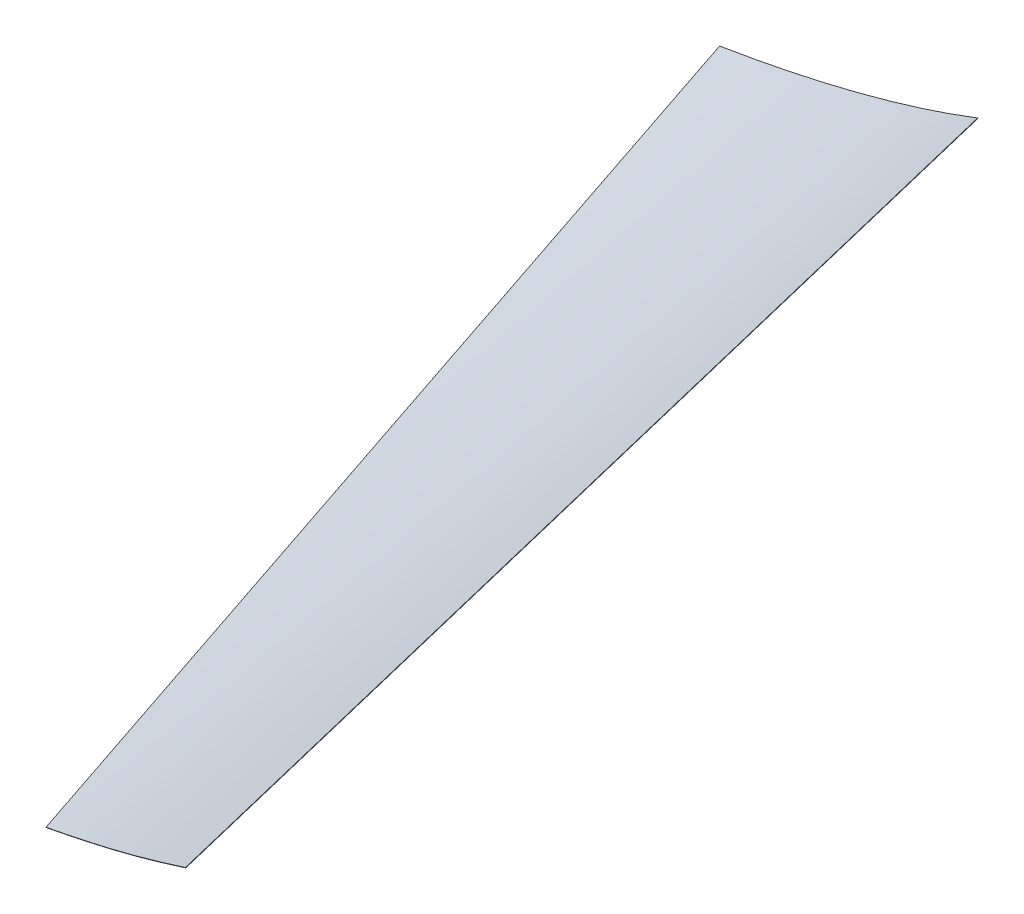
ISO-10303-21;
HEADER;
FILE_DESCRIPTION(('STEP AP214'),'2;1');
FILE_NAME('part.step','',(''),(''),'','','');
FILE_SCHEMA(('AUTOMOTIVE_DESIGN { 1 0 10303 214 1 1 1 1 }'));
ENDSEC;
DATA;
#1=APPLICATION_CONTEXT('core data for automotive mechanical design processes');
#2=APPLICATION_PROTOCOL_DEFINITION('international standard','automotive_design',2000,#1);
#3=PRODUCT_CONTEXT('',#1,'mechanical');
#4=PRODUCT('Part','Part','',(#3));
#5=PRODUCT_RELATED_PRODUCT_CATEGORY('part','',(#4));
#6=PRODUCT_DEFINITION_FORMATION('','',#4);
#7=PRODUCT_DEFINITION_CONTEXT('part definition',#1,'design');
#8=PRODUCT_DEFINITION('design','',#6,#7);
#9=PRODUCT_DEFINITION_SHAPE('','',#8);
#10=(LENGTH_UNIT() NAMED_UNIT(*) SI_UNIT(.MILLI.,.METRE.));
#11=(NAMED_UNIT(*) PLANE_ANGLE_UNIT() SI_UNIT($,.RADIAN.));
#12=(NAMED_UNIT(*) SI_UNIT($,.STERADIAN.) SOLID_ANGLE_UNIT());
#13=UNCERTAINTY_MEASURE_WITH_UNIT(LENGTH_MEASURE(1.E-05),#10,'distance_accuracy_value','');
#14=(GEOMETRIC_REPRESENTATION_CONTEXT(3) GLOBAL_UNCERTAINTY_ASSIGNED_CONTEXT((#13)) GLOBAL_UNIT_ASSIGNED_CONTEXT((#10,
#11,#12)) REPRESENTATION_CONTEXT('',''));
#15=CARTESIAN_POINT('',(0.,0.,0.));
#16=DIRECTION('',(0.,0.,1.));
#17=DIRECTION('',(1.,0.,0.));
#18=AXIS2_PLACEMENT_3D('',#15,#16,#17);
#19=CARTESIAN_POINT('',(1574.71196498995,85.531149793151,228.978380935127));
#20=CARTESIAN_POINT('',(1561.91301371153,77.9688786261809,224.72334072762));
#21=CARTESIAN_POINT('',(1549.03214065678,70.4827661801589,220.511114357923));
#22=CARTESIAN_POINT('',(1532.83202024088,61.2241789317838,215.301520346124));
#23=CARTESIAN_POINT('',(1529.58704837155,59.3774209095608,214.262389765311));
#24=CARTESIAN_POINT('',(1523.09153129289,55.6962849712968,212.191090050003));
#25=CARTESIAN_POINT('',(1519.8406741398,53.8617276881236,211.158819882845));
#26=CARTESIAN_POINT('',(1510.07880863448,48.3760845020888,208.072146649179));
#27=CARTESIAN_POINT('',(1503.55850623585,44.7430272629689,206.027880850378));
#28=CARTESIAN_POINT('',(1470.89505789411,26.6978868849103,195.874109598764));
#29=CARTESIAN_POINT('',(1444.56610278473,12.6462412889612,187.967277352713));
#30=CARTESIAN_POINT('',(1364.98557113886,-28.3570359806853,164.894412253143));
#31=CARTESIAN_POINT('',(1311.14113168851,-54.1586307820485,150.375093835823));
#32=CARTESIAN_POINT('',(1201.8625168335,-102.677967099693,123.070936872304));
#33=CARTESIAN_POINT('',(1146.42853738776,-125.396173327277,110.285869254329));
#34=CARTESIAN_POINT('',(1033.94743864746,-167.703246841028,86.475902100936));
#35=CARTESIAN_POINT('',(976.900041204333,-187.291733000254,75.4511682033716));
#36=CARTESIAN_POINT('',(919.025628638706,-205.27554913811,65.3288029953166));
#37=CARTESIAN_POINT('',(1574.25739791536,86.148212263556,229.249021882358));
#38=CARTESIAN_POINT('',(1561.46181485894,78.5874899568297,224.996107514632));
#39=CARTESIAN_POINT('',(1548.58434318374,71.1029013595175,220.786018439715));
#40=CARTESIAN_POINT('',(1532.38851394892,61.8461863156302,215.57910634706));
#41=CARTESIAN_POINT('',(1529.1444024378,59.9998011776519,214.540512736146));
#42=CARTESIAN_POINT('',(1522.65060801918,56.3194067619692,212.470286948931));
#43=CARTESIAN_POINT('',(1519.40061383859,54.4852184496488,211.438554065468));
#44=CARTESIAN_POINT('',(1509.64134214026,49.0006767897006,208.353493527636));
#45=CARTESIAN_POINT('',(1503.12277546595,45.3683467190857,206.310303985825));
#46=CARTESIAN_POINT('',(1470.46803781429,27.3268060854285,196.161918122144));
#47=CARTESIAN_POINT('',(1444.1461539966,13.2779246806376,188.259407336401));
#48=CARTESIAN_POINT('',(1364.58712117897,-27.7174119170193,165.19948674246));
#49=CARTESIAN_POINT('',(1310.75742107088,-53.5141703972989,150.68878256226));
#50=CARTESIAN_POINT('',(1201.50906592573,-102.024719098899,123.401547138236));
#51=CARTESIAN_POINT('',(1146.09063692024,-124.738947877756,110.624769205328));
#52=CARTESIAN_POINT('',(1033.6413956905,-167.038980459962,86.8309557274673));
#53=CARTESIAN_POINT('',(976.610352391961,-186.624404849818,75.8141336030086));
#54=CARTESIAN_POINT('',(918.752642642602,-204.605752604379,65.6996062980684));
#55=B_SPLINE_SURFACE_WITH_KNOTS('',1,3,((#19,#20,#21,#22,#23,#24,#25,#26,#27,#28,#29,#30,#31,
#32,#33,#34,#35,#36),(#37,#38,#39,#40,#41,#42,#43,#44,#45,#46,#47,#48,#49,#50,#51,#52,#53,#54)),
.UNSPECIFIED.,.F.,.F.,.F.,(2,2),(4,2,2,2,2,2,2,2,4),(0.,1.),(0.,0.0625,0.078125,0.09375,0.125,
0.25,0.5,0.75,1.),.UNSPECIFIED.);
#56=CARTESIAN_POINT('',(918.752642642602,-204.605752604379,65.6996062980681));
#57=CARTESIAN_POINT('',(919.025628638706,-205.27554913811,65.3288029953164));
#58=B_SPLINE_CURVE_WITH_KNOTS('',1,(#56,#57),.UNSPECIFIED.,.F.,.F.,(2,2),(0.,1.),.UNSPECIFIED.);
#59=CARTESIAN_POINT('',(918.752642642602,-204.605752604379,65.6996062980684));
#60=VERTEX_POINT('',#59);
#61=CARTESIAN_POINT('',(919.025628611184,-205.2755494895,65.3288036097837));
#62=VERTEX_POINT('',#61);
#63=EDGE_CURVE('E14',#60,#62,#58,.T.);
#64=CARTESIAN_POINT('',(918.752642642602,-204.605752604379,65.6996062980684));
#65=CARTESIAN_POINT('',(976.610352391961,-186.624404849818,75.8141336030086));
#66=CARTESIAN_POINT('',(1033.6413956905,-167.038980459962,86.8309557274673));
#67=CARTESIAN_POINT('',(1146.09063692024,-124.738947877756,110.624769205328));
#68=CARTESIAN_POINT('',(1201.50906592573,-102.024719098899,123.401547138236));
#69=CARTESIAN_POINT('',(1310.75742107088,-53.5141703972989,150.68878256226));
#70=CARTESIAN_POINT('',(1364.58712117897,-27.7174119170193,165.19948674246));
#71=CARTESIAN_POINT('',(1444.1461539966,13.2779246806376,188.259407336401));
#72=CARTESIAN_POINT('',(1470.46803781429,27.3268060854285,196.161918122144));
#73=CARTESIAN_POINT('',(1503.12277546595,45.3683467190857,206.310303985825));
#74=CARTESIAN_POINT('',(1509.64134214026,49.0006767897006,208.353493527636));
#75=CARTESIAN_POINT('',(1519.40061383859,54.4852184496488,211.438554065468));
#76=CARTESIAN_POINT('',(1522.65060801918,56.3194067619692,212.470286948931));
#77=CARTESIAN_POINT('',(1529.1444024378,59.9998011776519,214.540512736146));
#78=CARTESIAN_POINT('',(1532.38851394892,61.8461863156302,215.57910634706));
#79=CARTESIAN_POINT('',(1548.58434318374,71.1029013595175,220.786018439715));
#80=CARTESIAN_POINT('',(1561.46181485894,78.5874899568297,224.996107514632));
#81=CARTESIAN_POINT('',(1574.25739791536,86.148212263556,229.249021882358));
#82=B_SPLINE_CURVE_WITH_KNOTS('',3,(#64,#65,#66,#67,#68,#69,#70,#71,#72,#73,#74,#75,#76,#77,#78,
#79,#80,#81),.UNSPECIFIED.,.F.,.F.,(4,2,2,2,2,2,2,2,4),(0.,0.25,0.5,0.75,0.875,0.90625,0.921875,
0.9375,1.),.UNSPECIFIED.);
#83=CARTESIAN_POINT('',(1574.25739791536,86.148212263556,229.249021882358));
#84=VERTEX_POINT('',#83);
#85=EDGE_CURVE('E124',#60,#84,#82,.T.);
#86=CARTESIAN_POINT('',(1574.25739791536,86.148212263556,229.249021882358));
#87=CARTESIAN_POINT('',(1574.71196498995,85.531149793151,228.978380935127));
#88=B_SPLINE_CURVE_WITH_KNOTS('',1,(#86,#87),.UNSPECIFIED.,.F.,.F.,(2,2),(0.,1.),.UNSPECIFIED.);
#89=CARTESIAN_POINT('',(1574.71196498995,85.531149793151,228.978380935127));
#90=VERTEX_POINT('',#89);
#91=EDGE_CURVE('E73',#84,#90,#88,.T.);
#92=CARTESIAN_POINT('',(919.025628638706,-205.275549138104,65.3288029953046));
#93=CARTESIAN_POINT('',(933.485594408192,-200.782222044901,67.8579154654847));
#94=CARTESIAN_POINT('',(947.903102403879,-196.185852541037,70.444974370549));
#95=CARTESIAN_POINT('',(976.635295154276,-186.793601001696,75.7312909841225));
#96=CARTESIAN_POINT('',(990.950070859522,-181.997930307752,78.4304298392356));
#97=CARTESIAN_POINT('',(1033.72829172863,-167.317814514495,86.6926827290599));
#98=CARTESIAN_POINT('',(1062.05592170383,-157.130848764735,92.4259334813963));
#99=CARTESIAN_POINT('',(1118.30659273913,-135.973634628348,104.332988344937));
#100=CARTESIAN_POINT('',(1146.2298209144,-125.003763386126,110.506580332342));
#101=CARTESIAN_POINT('',(1201.67603639815,-102.287568040145,123.290512299399));
#102=CARTESIAN_POINT('',(1229.19879665065,-90.5408229082977,129.901089102757));
#103=CARTESIAN_POINT('',(1283.84710303327,-66.2770154889238,143.555498467897));
#104=CARTESIAN_POINT('',(1310.97196856905,-53.7587892735374,150.599985658112));
#105=CARTESIAN_POINT('',(1364.82625870666,-27.9550801736661,165.120457400104));
#106=CARTESIAN_POINT('',(1391.55450927246,-14.6677363278662,172.597488509702));
#107=CARTESIAN_POINT('',(1444.61663506759,12.6724263775358,187.982011726424));
#108=CARTESIAN_POINT('',(1470.9488041008,26.7277598500276,195.890917852696));
#109=CARTESIAN_POINT('',(1523.18123917786,55.5835561899171,212.127709650001));
#110=CARTESIAN_POINT('',(1549.07996847036,70.3861324854287,220.456783630915));
#111=CARTESIAN_POINT('',(1574.71196499009,85.5311497932181,228.978380935209));
#112=B_SPLINE_CURVE_WITH_KNOTS('',3,(#92,#93,#94,#95,#96,#97,#98,#99,#100,#101,#102,#103,#104,
#105,#106,#107,#108,#109,#110,#111),.UNSPECIFIED.,.F.,.F.,(4,2,2,2,2,2,2,2,2,4),(0.,
46.0542489930624,92.060848954102,183.977612606886,275.850392786245,367.773378181321,
459.838613476087,552.136764642055,644.75771507985,737.657164522862),.UNSPECIFIED.);
#113=EDGE_CURVE('E301',#62,#90,#112,.T.);
#114=ORIENTED_EDGE('',*,*,#63,.F.);
#115=ORIENTED_EDGE('',*,*,#85,.T.);
#116=ORIENTED_EDGE('',*,*,#91,.T.);
#117=ORIENTED_EDGE('',*,*,#113,.F.);
#118=EDGE_LOOP('',(#114,#115,#116,#117));
#119=FACE_BOUND('',#118,.T.);
#120=ADVANCED_FACE('F59',(#119),#55,.F.);
#121=CARTESIAN_POINT('',(1574.71196498995,85.531149793151,228.978380935127));
#122=CARTESIAN_POINT('',(1489.19714845487,-160.757564113525,646.887435004973));
#123=CARTESIAN_POINT('',(1403.68479075403,-407.0447662633,1064.7978832772));
#124=CARTESIAN_POINT('',(1318.17766917409,-653.327686516148,1482.71192669665));
#125=CARTESIAN_POINT('',(1574.25739791536,86.1482122635561,229.249021882358));
#126=CARTESIAN_POINT('',(1488.73096699012,-160.146471790229,647.152180445071));
#127=CARTESIAN_POINT('',(1403.20453606488,-406.441155844014,1065.05533900778));
#128=CARTESIAN_POINT('',(1317.67810513964,-652.735839897799,1482.9584975705));
#129=B_SPLINE_SURFACE_WITH_KNOTS('',1,3,((#121,#122,#123,#124),(#125,#126,#127,#128)),
.UNSPECIFIED.,.F.,.F.,.F.,(2,2),(4,4),(0.,1.),(-0.738845387318941,0.738845387318941),.UNSPECIFIED.);
#130=CARTESIAN_POINT('',(1574.25739791536,86.1482122635561,229.249021882358));
#131=CARTESIAN_POINT('',(1488.73096699012,-160.146471790229,647.152180445071));
#132=CARTESIAN_POINT('',(1403.20453606488,-406.441155844014,1065.05533900778));
#133=CARTESIAN_POINT('',(1317.67810513964,-652.735839897799,1482.9584975705));
#134=B_SPLINE_CURVE_WITH_KNOTS('',3,(#130,#131,#132,#133),.UNSPECIFIED.,.F.,.F.,(4,4),
(-0.738845387318941,0.738845387318941),.UNSPECIFIED.);
#135=CARTESIAN_POINT('',(1317.67810513964,-652.735839897799,1482.9584975705));
#136=VERTEX_POINT('',#135);
#137=EDGE_CURVE('E299',#84,#136,#134,.T.);
#138=CARTESIAN_POINT('',(1317.67810513964,-652.735839897799,1482.9584975705));
#139=CARTESIAN_POINT('',(1318.17766917409,-653.327686516148,1482.71192669665));
#140=B_SPLINE_CURVE_WITH_KNOTS('',1,(#138,#139),.UNSPECIFIED.,.F.,.F.,(2,2),(0.,1.),.UNSPECIFIED.);
#141=CARTESIAN_POINT('',(1318.17766930235,-653.327686146724,1482.71192606978));
#142=VERTEX_POINT('',#141);
#143=EDGE_CURVE('E113',#136,#142,#140,.T.);
#144=CARTESIAN_POINT('',(1574.71196499009,85.5311497932181,228.978380935209));
#145=CARTESIAN_POINT('',(1564.0226130746,54.745060735737,281.217012797724));
#146=CARTESIAN_POINT('',(1553.3333022479,23.9589988194493,333.455669063353));
#147=CARTESIAN_POINT('',(1531.95477062447,-37.6130637883714,437.9330361031));
#148=CARTESIAN_POINT('',(1521.26554982774,-68.3990644799043,490.171746877217));
#149=CARTESIAN_POINT('',(1499.88720611717,-129.970997694309,594.649228633588));
#150=CARTESIAN_POINT('',(1489.19808320334,-160.75693021718,646.887999615842));
#151=CARTESIAN_POINT('',(1467.81994426265,-222.3287187896,751.365608525645));
#152=CARTESIAN_POINT('',(1457.1309282358,-253.114574839148,803.604446453195));
#153=CARTESIAN_POINT('',(1435.75301306228,-314.686200920021,908.082196924132));
#154=CARTESIAN_POINT('',(1425.06411391561,-345.471970951345,960.321109467519));
#155=CARTESIAN_POINT('',(1403.68644374571,-407.043413793885,1064.79901807306));
#156=CARTESIAN_POINT('',(1392.99767272248,-437.829086605101,1117.03801413522));
#157=CARTESIAN_POINT('',(1371.62027127924,-499.400322101076,1221.51609993888));
#158=CARTESIAN_POINT('',(1360.93164085924,-530.185884785835,1273.75518968039));
#159=CARTESIAN_POINT('',(1339.55453512515,-591.756884045785,1378.23347523048));
#160=CARTESIAN_POINT('',(1328.86605981106,-622.542320620977,1430.47267103906));
#161=CARTESIAN_POINT('',(1318.17766930234,-653.327686146743,1482.71192606981));
#162=B_SPLINE_CURVE_WITH_KNOTS('',3,(#144,#145,#146,#147,#148,#149,#150,#151,#152,#153,#154,
#155,#156,#157,#158,#159,#160,#161),.UNSPECIFIED.,.F.,.F.,(4,2,2,2,2,2,2,2,4),(0.,
184.711346820564,369.422693652354,554.134040497361,738.845387357935,923.556734236937,
1108.26808113791,1292.9794280652,1477.69077502418),.UNSPECIFIED.);
#163=EDGE_CURVE('E134',#90,#142,#162,.T.);
#164=ORIENTED_EDGE('',*,*,#91,.F.);
#165=ORIENTED_EDGE('',*,*,#137,.T.);
#166=ORIENTED_EDGE('',*,*,#143,.T.);
#167=ORIENTED_EDGE('',*,*,#163,.F.);
#168=EDGE_LOOP('',(#164,#165,#166,#167));
#169=FACE_BOUND('',#168,.T.);
#170=ADVANCED_FACE('F158',(#169),#129,.T.);
#171=CARTESIAN_POINT('',(1318.17766917409,-653.327686516148,1482.71192669665));
#172=CARTESIAN_POINT('',(1245.98023680698,-699.91221571376,1448.25390501236));
#173=CARTESIAN_POINT('',(1172.630531011,-745.137774297241,1414.79738241904));
#174=CARTESIAN_POINT('',(1078.24879824659,-798.486892235008,1375.32857095534));
#175=CARTESIAN_POINT('',(1059.23772128742,-808.997571523008,1367.55240151327));
#176=CARTESIAN_POINT('',(1020.91475313412,-829.663526708166,1352.26275343043));
#177=CARTESIAN_POINT('',(1001.59996412553,-839.81476891782,1344.75226988947));
#178=CARTESIAN_POINT('',(943.252931794415,-869.789061513336,1322.57508502938));
#179=CARTESIAN_POINT('',(903.819271009192,-889.134963632636,1308.26095007824));
#180=CARTESIAN_POINT('',(864.01029422742,-908.033583930658,1294.27678947161));
#181=CARTESIAN_POINT('',(1317.67810513964,-652.735839897799,1482.9584975705));
#182=CARTESIAN_POINT('',(1245.48914348668,-699.31706322503,1448.50970283138));
#183=CARTESIAN_POINT('',(1172.15183162086,-744.538181872034,1415.06676331902));
#184=CARTESIAN_POINT('',(1077.79167418493,-797.88030300244,1375.61799726017));
#185=CARTESIAN_POINT('',(1058.78521681757,-808.389513369603,1367.84598946498));
#186=CARTESIAN_POINT('',(1020.47212332652,-829.052402727892,1352.56490444022));
#187=CARTESIAN_POINT('',(1001.16223977379,-839.202235467749,1345.05867167695));
#188=CARTESIAN_POINT('',(942.828630043679,-869.173285024042,1322.89380651169));
#189=CARTESIAN_POINT('',(903.402659209845,-888.518083728903,1308.58750555494));
#190=CARTESIAN_POINT('',(863.599999999977,-907.416733151524,1294.61115095744));
#191=B_SPLINE_SURFACE_WITH_KNOTS('',1,3,((#171,#172,#173,#174,#175,#176,#177,#178,#179,#180),
(#181,#182,#183,#184,#185,#186,#187,#188,#189,#190)),.UNSPECIFIED.,.F.,.F.,.F.,(2,2),(4,2,2,2,
4),(0.,1.),(0.,0.5,0.625,0.75,1.),.UNSPECIFIED.);
#192=CARTESIAN_POINT('',(1317.67810513964,-652.735839897799,1482.9584975705));
#193=CARTESIAN_POINT('',(1245.48914348668,-699.31706322503,1448.50970283138));
#194=CARTESIAN_POINT('',(1172.15183162086,-744.538181872034,1415.06676331902));
#195=CARTESIAN_POINT('',(1077.79167418493,-797.88030300244,1375.61799726017));
#196=CARTESIAN_POINT('',(1058.78521681757,-808.389513369603,1367.84598946498));
#197=CARTESIAN_POINT('',(1020.47212332652,-829.052402727892,1352.56490444022));
#198=CARTESIAN_POINT('',(1001.16223977379,-839.202235467749,1345.05867167695));
#199=CARTESIAN_POINT('',(942.828630043679,-869.173285024042,1322.89380651169));
#200=CARTESIAN_POINT('',(903.402659209845,-888.518083728903,1308.58750555494));
#201=CARTESIAN_POINT('',(863.599999999977,-907.416733151524,1294.61115095744));
#202=B_SPLINE_CURVE_WITH_KNOTS('',3,(#192,#193,#194,#195,#196,#197,#198,#199,#200,#201),
.UNSPECIFIED.,.F.,.F.,(4,2,2,2,4),(0.,0.5,0.625,0.75,1.),.UNSPECIFIED.);
#203=CARTESIAN_POINT('',(863.599999999977,-907.416733151524,1294.61115095744));
#204=VERTEX_POINT('',#203);
#205=EDGE_CURVE('E122',#136,#204,#202,.T.);
#206=CARTESIAN_POINT('',(863.599999999977,-907.416733151524,1294.61115095744));
#207=CARTESIAN_POINT('',(864.01029422742,-908.033583930658,1294.27678947161));
#208=B_SPLINE_CURVE_WITH_KNOTS('',1,(#206,#207),.UNSPECIFIED.,.F.,.F.,(2,2),(0.,1.),.UNSPECIFIED.);
#209=CARTESIAN_POINT('',(864.010294254909,-908.033583579294,1294.27678885712));
#210=VERTEX_POINT('',#209);
#211=EDGE_CURVE('E101',#204,#210,#208,.T.);
#212=CARTESIAN_POINT('',(1318.17766917412,-653.327686516151,1482.71192669672));
#213=CARTESIAN_POINT('',(1300.13642936229,-664.968529136353,1474.10133093603));
#214=CARTESIAN_POINT('',(1282.01503123181,-676.529902968836,1465.54928579369));
#215=CARTESIAN_POINT('',(1245.59666427107,-699.445487027226,1448.59802381152));
#216=CARTESIAN_POINT('',(1227.29986330799,-710.799870001961,1440.19867954947));
#217=CARTESIAN_POINT('',(1190.49877032103,-733.26472124918,1423.58005898523));
#218=CARTESIAN_POINT('',(1171.99465772899,-744.375379033663,1415.36064278854));
#219=CARTESIAN_POINT('',(1144.0557307668,-760.832708493438,1403.18563331818));
#220=CARTESIAN_POINT('',(1134.714602016,-766.282401608937,1399.15394970593));
#221=CARTESIAN_POINT('',(1115.96883259159,-777.106869738501,1391.14592965939));
#222=CARTESIAN_POINT('',(1106.56420792756,-782.481662661981,1387.16957999452));
#223=CARTESIAN_POINT('',(1087.68754442255,-793.151647816637,1379.27569819797));
#224=CARTESIAN_POINT('',(1078.21551625445,-798.446852254283,1375.35815704696));
#225=CARTESIAN_POINT('',(1059.20017236545,-808.953149419657,1367.58523539568));
#226=CARTESIAN_POINT('',(1049.65686006561,-814.164246146425,1363.72985194004));
#227=CARTESIAN_POINT('',(1035.28571461562,-821.913814471262,1357.99635599041));
#228=CARTESIAN_POINT('',(1030.48586355929,-824.485880400258,1356.09341248565));
#229=CARTESIAN_POINT('',(1020.86744849319,-829.6077805498,1352.30395875634));
#230=CARTESIAN_POINT('',(1016.04888341427,-832.157613472309,1350.41744949129));
#231=CARTESIAN_POINT('',(1001.56549362572,-839.775447802194,1344.78132407676));
#232=CARTESIAN_POINT('',(991.874295383711,-844.811072961594,1341.05563693827));
#233=CARTESIAN_POINT('',(972.425003529986,-854.80266628869,1333.66312173715));
#234=CARTESIAN_POINT('',(962.666892674138,-859.758612730307,1329.99630972842));
#235=CARTESIAN_POINT('',(943.088777244637,-869.596828579406,1322.71710990014));
#236=CARTESIAN_POINT('',(933.268752636451,-874.479072198193,1319.10474113105));
#237=CARTESIAN_POINT('',(913.571832219849,-884.175799127328,1311.93003961163));
#238=CARTESIAN_POINT('',(903.69491553889,-888.990254997208,1308.3677271252));
#239=CARTESIAN_POINT('',(883.889176612857,-898.557355095144,1301.28872606455));
#240=CARTESIAN_POINT('',(873.960334094038,-903.30997218682,1297.77205752159));
#241=CARTESIAN_POINT('',(864.010294227501,-908.033583930618,1294.27678947163));
#242=B_SPLINE_CURVE_WITH_KNOTS('',3,(#212,#213,#214,#215,#216,#217,#218,#219,#220,#221,#222,
#223,#224,#225,#226,#227,#228,#229,#230,#231,#232,#233,#234,#235,#236,#237,#238,#239,#240,#241),
.UNSPECIFIED.,.F.,.F.,(4,2,2,2,2,2,2,2,2,2,2,2,2,2,4),(0.,69.3998533406953,138.738858409086,
208.02188619457,242.646470188379,277.262627897024,311.873421215064,346.48256402851,
363.78789826011,381.094236159098,415.711682628973,450.338413437143,484.976991746712,
519.629210403097,554.296154580483),.UNSPECIFIED.);
#243=EDGE_CURVE('E114',#142,#210,#242,.T.);
#244=ORIENTED_EDGE('',*,*,#143,.F.);
#245=ORIENTED_EDGE('',*,*,#205,.T.);
#246=ORIENTED_EDGE('',*,*,#211,.T.);
#247=ORIENTED_EDGE('',*,*,#243,.F.);
#248=EDGE_LOOP('',(#244,#245,#246,#247));
#249=FACE_BOUND('',#248,.T.);
#250=ADVANCED_FACE('F130',(#249),#191,.T.);
#251=CARTESIAN_POINT('',(864.01029422742,-908.033583930658,1294.27678947161));
#252=CARTESIAN_POINT('',(882.336873949243,-673.79145046435,884.620897661224));
#253=CARTESIAN_POINT('',(900.677063766355,-439.535513175577,474.973510899472));
#254=CARTESIAN_POINT('',(919.025628638706,-205.27554913811,65.3288029953164));
#255=CARTESIAN_POINT('',(863.599999999977,-907.416733151524,1294.61115095744));
#256=CARTESIAN_POINT('',(881.984214214185,-673.146406302475,884.973969404316));
#257=CARTESIAN_POINT('',(900.368428428393,-438.876079453427,475.336787851192));
#258=CARTESIAN_POINT('',(918.752642642602,-204.605752604379,65.6996062980681));
#259=B_SPLINE_SURFACE_WITH_KNOTS('',1,3,((#251,#252,#253,#254),(#255,#256,#257,#258)),
.UNSPECIFIED.,.F.,.F.,.F.,(2,2),(4,4),(0.,1.),(-0.708379960361173,0.708379960361173),.UNSPECIFIED.);
#260=CARTESIAN_POINT('',(863.599999999977,-907.416733151524,1294.61115095744));
#261=CARTESIAN_POINT('',(881.984214214185,-673.146406302475,884.973969404316));
#262=CARTESIAN_POINT('',(900.368428428393,-438.876079453427,475.336787851192));
#263=CARTESIAN_POINT('',(918.752642642602,-204.605752604379,65.6996062980681));
#264=B_SPLINE_CURVE_WITH_KNOTS('',3,(#260,#261,#262,#263),.UNSPECIFIED.,.F.,.F.,(4,4),
(-0.708379960361173,0.708379960361173),.UNSPECIFIED.);
#265=EDGE_CURVE('E103',#204,#60,#264,.T.);
#266=CARTESIAN_POINT('',(864.010294254896,-908.033583579296,1294.27678885711));
#267=CARTESIAN_POINT('',(866.301116081317,-878.753315512065,1243.0698032541));
#268=CARTESIAN_POINT('',(868.592149020742,-849.472818073448,1191.86295825144));
#269=CARTESIAN_POINT('',(873.174619240466,-790.911419408565,1089.44951731761));
#270=CARTESIAN_POINT('',(875.466056520764,-761.6305181823,1038.24292138644));
#271=CARTESIAN_POINT('',(880.049317540522,-703.068366853504,935.829946389871));
#272=CARTESIAN_POINT('',(882.341141279981,-673.787116750974,884.623567324475));
#273=CARTESIAN_POINT('',(886.92515445458,-615.224313308715,782.210999026647));
#274=CARTESIAN_POINT('',(889.21734388972,-585.942759968988,731.004809794214));
#275=CARTESIAN_POINT('',(893.802067074197,-527.379389978657,628.59259736887));
#276=CARTESIAN_POINT('',(896.094600823533,-498.097573328054,577.386574175958));
#277=CARTESIAN_POINT('',(900.679991112741,-439.533710920103,474.974673302461));
#278=CARTESIAN_POINT('',(902.972847652612,-410.251665162755,423.768795621877));
#279=CARTESIAN_POINT('',(907.558862376991,-351.687374273621,321.357167820149));
#280=CARTESIAN_POINT('',(909.852020561497,-322.405129141834,270.151417699005));
#281=CARTESIAN_POINT('',(914.438618463888,-263.840464176649,167.740030003091));
#282=CARTESIAN_POINT('',(916.732058181772,-234.55804434325,116.53439242832));
#283=CARTESIAN_POINT('',(919.025628611182,-205.2755494895,65.3288036097824));
#284=B_SPLINE_CURVE_WITH_KNOTS('',3,(#266,#267,#268,#269,#270,#271,#272,#273,#274,#275,#276,
#277,#278,#279,#280,#281,#282,#283),.UNSPECIFIED.,.F.,.F.,(4,2,2,2,2,2,2,2,4),(0.,
177.094991557542,354.189982885607,531.28497401928,708.379964987962,885.474955816831,
1062.5699465266,1239.66493713501,1416.75992765673),.UNSPECIFIED.);
#285=EDGE_CURVE('E106',#210,#62,#284,.T.);
#286=ORIENTED_EDGE('',*,*,#265,.T.);
#287=ORIENTED_EDGE('',*,*,#63,.T.);
#288=ORIENTED_EDGE('',*,*,#285,.F.);
#289=ORIENTED_EDGE('',*,*,#211,.F.);
#290=EDGE_LOOP('',(#286,#287,#288,#289));
#291=FACE_BOUND('',#290,.T.);
#292=ADVANCED_FACE('F61',(#291),#259,.T.);
#293=CARTESIAN_POINT('',(1317.67810513964,-652.735839897799,1482.9584975705));
#294=CARTESIAN_POINT('',(1574.25739791536,86.148212263556,229.249021882358));
#295=CARTESIAN_POINT('',(1315.39584949917,-654.208506317213,1481.86939815279));
#296=CARTESIAN_POINT('',(1571.020974231,84.2358569893569,228.173319999404));
#297=CARTESIAN_POINT('',(1309.11540668521,-658.255298596031,1478.87662324035));
#298=CARTESIAN_POINT('',(1562.10521699695,78.9895749970155,225.222280778915));
#299=CARTESIAN_POINT('',(1302.82604109294,-662.291522746413,1475.89166390811));
#300=CARTESIAN_POINT('',(1553.15068362937,73.7808162162024,222.292348404963));
#301=CARTESIAN_POINT('',(1294.81303698155,-667.420078191243,1472.09887915048));
#302=CARTESIAN_POINT('',(1541.72129823432,67.1813960486798,218.580167516617));
#303=CARTESIAN_POINT('',(1290.80275094789,-669.979874174484,1470.2058012083));
#304=CARTESIAN_POINT('',(1535.98974728669,63.8963603521061,216.732331430901));
#305=CARTESIAN_POINT('',(1254.67459166178,-692.975891210183,1453.1992690888));
#306=CARTESIAN_POINT('',(1484.28383207345,34.4812380120589,200.186293717399));
#307=CARTESIAN_POINT('',(1222.30762352676,-713.117084568318,1438.30400043256));
#308=CARTESIAN_POINT('',(1437.70135940407,9.54063615437839,186.157178551259));
#309=CARTESIAN_POINT('',(1156.89360283561,-752.593980073148,1409.109158111));
#310=CARTESIAN_POINT('',(1343.29642709017,-37.9346840357493,159.452260269924));
#311=CARTESIAN_POINT('',(1123.84655027948,-771.929682219843,1394.80958444568));
#312=CARTESIAN_POINT('',(1295.47396956263,-60.4694064756979,146.776454844254));
#313=CARTESIAN_POINT('',(1071.3652677023,-801.451574817152,1372.9768899445));
#314=CARTESIAN_POINT('',(1219.51992644882,-93.903883495719,127.969525833073));
#315=CARTESIAN_POINT('',(1037.64870090695,-819.994305063793,1359.26375270715));
#316=CARTESIAN_POINT('',(1170.7203507658,-114.542753382715,116.360139492042));
#317=CARTESIAN_POINT('',(1003.45570200655,-837.972749669493,1345.96792868812));
#318=CARTESIAN_POINT('',(1121.29284140839,-133.963275567342,105.436075034038));
#319=CARTESIAN_POINT('',(954.21996797153,-863.407119121969,1327.15813130619));
#320=CARTESIAN_POINT('',(1050.11277268394,-161.018578584688,90.2174382083882));
#321=CARTESIAN_POINT('',(919.413474717856,-880.658941716522,1314.39967515186));
#322=CARTESIAN_POINT('',(999.780844961284,-178.684303913828,80.280448854638));
#323=CARTESIAN_POINT('',(877.405133232841,-900.843108056029,1299.47262614919));
#324=CARTESIAN_POINT('',(938.811551089124,-198.315603346795,69.2378219694627));
#325=CARTESIAN_POINT('',(870.508240271291,-904.136640474137,1297.03691892353));
#326=CARTESIAN_POINT('',(928.794563960569,-201.484867243992,67.4551076444687));
#327=CARTESIAN_POINT('',(863.599999999977,-907.416733151524,1294.61115095744));
#328=CARTESIAN_POINT('',(918.752642642602,-204.605752604379,65.6996062980684));
#329=B_SPLINE_SURFACE_WITH_KNOTS('',3,1,((#293,#294),(#295,#296),(#297,#298),(#299,#300),(#301,
#302),(#303,#304),(#305,#306),(#307,#308),(#309,#310),(#311,#312),(#313,#314),(#315,#316),(#317,
#318),(#319,#320),(#321,#322),(#323,#324),(#325,#326),(#327,#328)),.UNSPECIFIED.,.F.,.F.,.F.,(4,
1,2,2,2,2,1,2,2,4),(2,2),(0.,0.0158075112054138,0.0434781558779154,0.0711488005504169,
0.29251395793042,0.513879115310423,0.639574266343319,0.735244272690429,0.956609430070432,1.),
(0.,1.),.UNSPECIFIED.);
#330=OFFSET_SURFACE('',#329,0.8128,.F.);
#331=ORIENTED_EDGE('',*,*,#243,.T.);
#332=ORIENTED_EDGE('',*,*,#285,.T.);
#333=ORIENTED_EDGE('',*,*,#113,.T.);
#334=ORIENTED_EDGE('',*,*,#163,.T.);
#335=EDGE_LOOP('',(#331,#332,#333,#334));
#336=FACE_BOUND('',#335,.T.);
#337=ADVANCED_FACE('F159',(#336),#330,.T.);
#338=CARTESIAN_POINT('',(1317.67810513964,-652.735839897799,1482.9584975705));
#339=CARTESIAN_POINT('',(1574.25739791536,86.148212263556,229.249021882358));
#340=CARTESIAN_POINT('',(1315.39584949917,-654.208506317213,1481.86939815279));
#341=CARTESIAN_POINT('',(1571.020974231,84.2358569893569,228.173319999404));
#342=CARTESIAN_POINT('',(1309.11540668521,-658.255298596031,1478.87662324035));
#343=CARTESIAN_POINT('',(1562.10521699695,78.9895749970155,225.222280778915));
#344=CARTESIAN_POINT('',(1302.82604109294,-662.291522746413,1475.89166390811));
#345=CARTESIAN_POINT('',(1553.15068362937,73.7808162162024,222.292348404963));
#346=CARTESIAN_POINT('',(1294.81303698155,-667.420078191243,1472.09887915048));
#347=CARTESIAN_POINT('',(1541.72129823432,67.1813960486798,218.580167516617));
#348=CARTESIAN_POINT('',(1290.80275094789,-669.979874174484,1470.2058012083));
#349=CARTESIAN_POINT('',(1535.98974728669,63.8963603521061,216.732331430901));
#350=CARTESIAN_POINT('',(1254.67459166178,-692.975891210183,1453.1992690888));
#351=CARTESIAN_POINT('',(1484.28383207345,34.4812380120589,200.186293717399));
#352=CARTESIAN_POINT('',(1222.30762352676,-713.117084568318,1438.30400043256));
#353=CARTESIAN_POINT('',(1437.70135940407,9.54063615437839,186.157178551259));
#354=CARTESIAN_POINT('',(1156.89360283561,-752.593980073148,1409.109158111));
#355=CARTESIAN_POINT('',(1343.29642709017,-37.9346840357493,159.452260269924));
#356=CARTESIAN_POINT('',(1123.84655027948,-771.929682219843,1394.80958444568));
#357=CARTESIAN_POINT('',(1295.47396956263,-60.4694064756979,146.776454844254));
#358=CARTESIAN_POINT('',(1071.3652677023,-801.451574817152,1372.9768899445));
#359=CARTESIAN_POINT('',(1219.51992644882,-93.903883495719,127.969525833073));
#360=CARTESIAN_POINT('',(1037.64870090695,-819.994305063793,1359.26375270715));
#361=CARTESIAN_POINT('',(1170.7203507658,-114.542753382715,116.360139492042));
#362=CARTESIAN_POINT('',(1003.45570200655,-837.972749669493,1345.96792868812));
#363=CARTESIAN_POINT('',(1121.29284140839,-133.963275567342,105.436075034038));
#364=CARTESIAN_POINT('',(954.21996797153,-863.407119121969,1327.15813130619));
#365=CARTESIAN_POINT('',(1050.11277268394,-161.018578584688,90.2174382083882));
#366=CARTESIAN_POINT('',(919.413474717856,-880.658941716522,1314.39967515186));
#367=CARTESIAN_POINT('',(999.780844961284,-178.684303913828,80.280448854638));
#368=CARTESIAN_POINT('',(877.405133232841,-900.843108056029,1299.47262614919));
#369=CARTESIAN_POINT('',(938.811551089124,-198.315603346795,69.2378219694627));
#370=CARTESIAN_POINT('',(870.508240271291,-904.136640474137,1297.03691892353));
#371=CARTESIAN_POINT('',(928.794563960569,-201.484867243992,67.4551076444687));
#372=CARTESIAN_POINT('',(863.599999999977,-907.416733151524,1294.61115095744));
#373=CARTESIAN_POINT('',(918.752642642602,-204.605752604379,65.6996062980684));
#374=B_SPLINE_SURFACE_WITH_KNOTS('',3,1,((#338,#339),(#340,#341),(#342,#343),(#344,#345),(#346,
#347),(#348,#349),(#350,#351),(#352,#353),(#354,#355),(#356,#357),(#358,#359),(#360,#361),(#362,
#363),(#364,#365),(#366,#367),(#368,#369),(#370,#371),(#372,#373)),.UNSPECIFIED.,.F.,.F.,.F.,(4,
1,2,2,2,2,1,2,2,4),(2,2),(0.,0.0158075112054138,0.0434781558779154,0.0711488005504169,
0.29251395793042,0.513879115310423,0.639574266343319,0.735244272690429,0.956609430070432,1.),
(0.,1.),.UNSPECIFIED.);
#375=ORIENTED_EDGE('',*,*,#205,.F.);
#376=ORIENTED_EDGE('',*,*,#137,.F.);
#377=ORIENTED_EDGE('',*,*,#85,.F.);
#378=ORIENTED_EDGE('',*,*,#265,.F.);
#379=EDGE_LOOP('',(#375,#376,#377,#378));
#380=FACE_BOUND('',#379,.T.);
#381=ADVANCED_FACE('F120',(#380),#374,.F.);
#382=CLOSED_SHELL('',(#120,#170,#250,#292,#337,#381));
#383=MANIFOLD_SOLID_BREP('B2',#382);
#384=ADVANCED_BREP_SHAPE_REPRESENTATION('',(#18,#383),#14);
#385=SHAPE_DEFINITION_REPRESENTATION(#9,#384);
ENDSEC;
END-ISO-10303-21;
